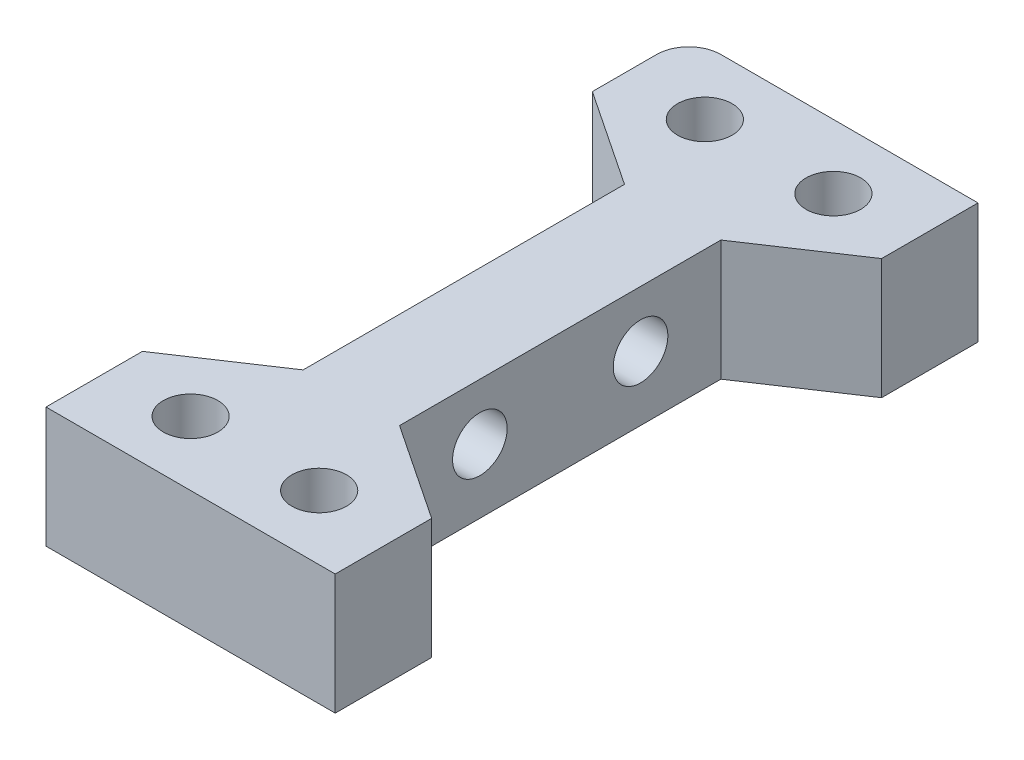
ISO-10303-21;
HEADER;
FILE_DESCRIPTION(('STEP AP214'),'2;1');
FILE_NAME('part.step','',(''),(''),'','','');
FILE_SCHEMA(('AUTOMOTIVE_DESIGN { 1 0 10303 214 1 1 1 1 }'));
ENDSEC;
DATA;
#1=APPLICATION_CONTEXT('core data for automotive mechanical design processes');
#2=APPLICATION_PROTOCOL_DEFINITION('international standard','automotive_design',2000,#1);
#3=PRODUCT_CONTEXT('',#1,'mechanical');
#4=PRODUCT('Part','Part','',(#3));
#5=PRODUCT_RELATED_PRODUCT_CATEGORY('part','',(#4));
#6=PRODUCT_DEFINITION_FORMATION('','',#4);
#7=PRODUCT_DEFINITION_CONTEXT('part definition',#1,'design');
#8=PRODUCT_DEFINITION('design','',#6,#7);
#9=PRODUCT_DEFINITION_SHAPE('','',#8);
#10=(LENGTH_UNIT() NAMED_UNIT(*) SI_UNIT(.MILLI.,.METRE.));
#11=(NAMED_UNIT(*) PLANE_ANGLE_UNIT() SI_UNIT($,.RADIAN.));
#12=(NAMED_UNIT(*) SI_UNIT($,.STERADIAN.) SOLID_ANGLE_UNIT());
#13=UNCERTAINTY_MEASURE_WITH_UNIT(LENGTH_MEASURE(1.E-05),#10,'distance_accuracy_value','');
#14=(GEOMETRIC_REPRESENTATION_CONTEXT(3) GLOBAL_UNCERTAINTY_ASSIGNED_CONTEXT((#13)) GLOBAL_UNIT_ASSIGNED_CONTEXT((#10,
#11,#12)) REPRESENTATION_CONTEXT('',''));
#15=CARTESIAN_POINT('',(0.,0.,0.));
#16=DIRECTION('',(0.,0.,1.));
#17=DIRECTION('',(1.,0.,0.));
#18=AXIS2_PLACEMENT_3D('',#15,#16,#17);
#19=CARTESIAN_POINT('',(-3.69230769230769,7.5,5.53846153846153));
#20=DIRECTION('',(-0.55470019622523,0.,0.832050294337843));
#21=DIRECTION('',(0.832050294337843,0.,0.55470019622523));
#22=AXIS2_PLACEMENT_3D('',#19,#20,#21);
#23=PLANE('',#22);
#24=DIRECTION('',(-0.832050294337843,0.,-0.55470019622523));
#25=VECTOR('',#24,1.);
#26=CARTESIAN_POINT('',(-3.69230769230769,0.,5.53846153846153));
#27=LINE('',#26,#25);
#28=CARTESIAN_POINT('',(9.,0.,14.));
#29=VERTEX_POINT('',#28);
#30=CARTESIAN_POINT('',(3.,0.,10.));
#31=VERTEX_POINT('',#30);
#32=EDGE_CURVE('E152',#29,#31,#27,.T.);
#33=ORIENTED_EDGE('',*,*,#32,.T.);
#34=DIRECTION('',(0.,-1.,0.));
#35=VECTOR('',#34,1.);
#36=CARTESIAN_POINT('',(3.,7.5,10.));
#37=LINE('',#36,#35);
#38=CARTESIAN_POINT('',(3.,7.5,10.));
#39=VERTEX_POINT('',#38);
#40=EDGE_CURVE('E132',#39,#31,#37,.T.);
#41=ORIENTED_EDGE('',*,*,#40,.F.);
#42=DIRECTION('',(-0.832050294337843,0.,-0.55470019622523));
#43=VECTOR('',#42,1.);
#44=CARTESIAN_POINT('',(-3.69230769230769,7.5,5.53846153846153));
#45=LINE('',#44,#43);
#46=CARTESIAN_POINT('',(9.,7.5,14.));
#47=VERTEX_POINT('',#46);
#48=EDGE_CURVE('E139',#47,#39,#45,.T.);
#49=ORIENTED_EDGE('',*,*,#48,.F.);
#50=DIRECTION('',(0.,-1.,0.));
#51=VECTOR('',#50,1.);
#52=CARTESIAN_POINT('',(9.,7.5,14.));
#53=LINE('',#52,#51);
#54=EDGE_CURVE('E180',#47,#29,#53,.T.);
#55=ORIENTED_EDGE('',*,*,#54,.T.);
#56=EDGE_LOOP('',(#33,#41,#49,#55));
#57=FACE_BOUND('',#56,.T.);
#58=ADVANCED_FACE('F34',(#57),#23,.F.);
#59=CARTESIAN_POINT('',(3.,7.5,0.));
#60=DIRECTION('',(-1.,0.,0.));
#61=DIRECTION('',(0.,0.,1.));
#62=AXIS2_PLACEMENT_3D('',#59,#60,#61);
#63=PLANE('',#62);
#64=CARTESIAN_POINT('',(3.,4.,5.));
#65=DIRECTION('',(1.,0.,0.));
#66=DIRECTION('',(0.,0.,-1.));
#67=AXIS2_PLACEMENT_3D('',#64,#65,#66);
#68=CIRCLE('',#67,1.7);
#69=CARTESIAN_POINT('',(3.,4.,3.3));
#70=VERTEX_POINT('',#69);
#71=EDGE_CURVE('E261',#70,#70,#68,.T.);
#72=ORIENTED_EDGE('',*,*,#71,.F.);
#73=EDGE_LOOP('',(#72));
#74=FACE_BOUND('',#73,.T.);
#75=CARTESIAN_POINT('',(3.,4.,-5.));
#76=DIRECTION('',(1.,0.,0.));
#77=DIRECTION('',(0.,0.,-1.));
#78=AXIS2_PLACEMENT_3D('',#75,#76,#77);
#79=CIRCLE('',#78,1.7);
#80=CARTESIAN_POINT('',(3.,4.,-6.7));
#81=VERTEX_POINT('',#80);
#82=EDGE_CURVE('E255',#81,#81,#79,.T.);
#83=ORIENTED_EDGE('',*,*,#82,.F.);
#84=EDGE_LOOP('',(#83));
#85=FACE_BOUND('',#84,.T.);
#86=DIRECTION('',(0.,0.,-1.));
#87=VECTOR('',#86,1.);
#88=CARTESIAN_POINT('',(3.,0.,0.));
#89=LINE('',#88,#87);
#90=CARTESIAN_POINT('',(3.,0.,-10.));
#91=VERTEX_POINT('',#90);
#92=EDGE_CURVE('E216',#31,#91,#89,.T.);
#93=ORIENTED_EDGE('',*,*,#92,.T.);
#94=DIRECTION('',(0.,-1.,0.));
#95=VECTOR('',#94,1.);
#96=CARTESIAN_POINT('',(3.,7.5,-10.));
#97=LINE('',#96,#95);
#98=CARTESIAN_POINT('',(3.,7.5,-10.));
#99=VERTEX_POINT('',#98);
#100=EDGE_CURVE('E134',#99,#91,#97,.T.);
#101=ORIENTED_EDGE('',*,*,#100,.F.);
#102=DIRECTION('',(0.,0.,-1.));
#103=VECTOR('',#102,1.);
#104=CARTESIAN_POINT('',(3.,7.5,0.));
#105=LINE('',#104,#103);
#106=EDGE_CURVE('E127',#39,#99,#105,.T.);
#107=ORIENTED_EDGE('',*,*,#106,.F.);
#108=ORIENTED_EDGE('',*,*,#40,.T.);
#109=EDGE_LOOP('',(#93,#101,#107,#108));
#110=FACE_BOUND('',#109,.T.);
#111=ADVANCED_FACE('F130',(#74,#85,#110),#63,.F.);
#112=CARTESIAN_POINT('',(-3.69230769230769,7.5,-5.53846153846154));
#113=DIRECTION('',(0.554700196225229,0.,0.832050294337844));
#114=DIRECTION('',(0.832050294337844,0.,-0.554700196225229));
#115=AXIS2_PLACEMENT_3D('',#112,#113,#114);
#116=PLANE('',#115);
#117=DIRECTION('',(-0.832050294337844,0.,0.554700196225229));
#118=VECTOR('',#117,1.);
#119=CARTESIAN_POINT('',(-3.69230769230769,0.,-5.53846153846154));
#120=LINE('',#119,#118);
#121=CARTESIAN_POINT('',(9.,0.,-14.));
#122=VERTEX_POINT('',#121);
#123=EDGE_CURVE('E213',#122,#91,#120,.T.);
#124=ORIENTED_EDGE('',*,*,#123,.F.);
#125=DIRECTION('',(0.,-1.,0.));
#126=VECTOR('',#125,1.);
#127=CARTESIAN_POINT('',(9.,7.5,-14.));
#128=LINE('',#127,#126);
#129=CARTESIAN_POINT('',(9.,7.5,-14.));
#130=VERTEX_POINT('',#129);
#131=EDGE_CURVE('E157',#130,#122,#128,.T.);
#132=ORIENTED_EDGE('',*,*,#131,.F.);
#133=DIRECTION('',(-0.832050294337844,0.,0.554700196225229));
#134=VECTOR('',#133,1.);
#135=CARTESIAN_POINT('',(-3.69230769230769,7.5,-5.53846153846154));
#136=LINE('',#135,#134);
#137=EDGE_CURVE('E138',#130,#99,#136,.T.);
#138=ORIENTED_EDGE('',*,*,#137,.T.);
#139=ORIENTED_EDGE('',*,*,#100,.T.);
#140=EDGE_LOOP('',(#124,#132,#138,#139));
#141=FACE_BOUND('',#140,.T.);
#142=ADVANCED_FACE('F279',(#141),#116,.T.);
#143=CARTESIAN_POINT('',(8.99999999999999,7.5,0.));
#144=DIRECTION('',(1.,0.,0.));
#145=DIRECTION('',(0.,0.,-1.));
#146=AXIS2_PLACEMENT_3D('',#143,#144,#145);
#147=PLANE('',#146);
#148=DIRECTION('',(0.,0.,1.));
#149=VECTOR('',#148,1.);
#150=CARTESIAN_POINT('',(8.99999999999999,0.,0.));
#151=LINE('',#150,#149);
#152=CARTESIAN_POINT('',(9.,0.,-20.));
#153=VERTEX_POINT('',#152);
#154=EDGE_CURVE('E210',#153,#122,#151,.T.);
#155=ORIENTED_EDGE('',*,*,#154,.F.);
#156=DIRECTION('',(0.,-1.,0.));
#157=VECTOR('',#156,1.);
#158=CARTESIAN_POINT('',(9.,7.5,-20.));
#159=LINE('',#158,#157);
#160=CARTESIAN_POINT('',(9.,7.5,-20.));
#161=VERTEX_POINT('',#160);
#162=EDGE_CURVE('E162',#161,#153,#159,.T.);
#163=ORIENTED_EDGE('',*,*,#162,.F.);
#164=DIRECTION('',(0.,0.,1.));
#165=VECTOR('',#164,1.);
#166=CARTESIAN_POINT('',(8.99999999999999,7.5,0.));
#167=LINE('',#166,#165);
#168=EDGE_CURVE('E249',#161,#130,#167,.T.);
#169=ORIENTED_EDGE('',*,*,#168,.T.);
#170=ORIENTED_EDGE('',*,*,#131,.T.);
#171=EDGE_LOOP('',(#155,#163,#169,#170));
#172=FACE_BOUND('',#171,.T.);
#173=ADVANCED_FACE('F360',(#172),#147,.T.);
#174=CARTESIAN_POINT('',(0.,7.5,-20.));
#175=DIRECTION('',(0.,0.,-1.));
#176=DIRECTION('',(-1.,0.,0.));
#177=AXIS2_PLACEMENT_3D('',#174,#175,#176);
#178=PLANE('',#177);
#179=DIRECTION('',(1.,0.,0.));
#180=VECTOR('',#179,1.);
#181=CARTESIAN_POINT('',(0.,0.,-20.));
#182=LINE('',#181,#180);
#183=CARTESIAN_POINT('',(-7.,0.,-20.));
#184=VERTEX_POINT('',#183);
#185=EDGE_CURVE('E208',#184,#153,#182,.T.);
#186=ORIENTED_EDGE('',*,*,#185,.F.);
#187=DIRECTION('',(0.,-1.,0.));
#188=VECTOR('',#187,1.);
#189=CARTESIAN_POINT('',(-7.,7.5,-20.));
#190=LINE('',#189,#188);
#191=CARTESIAN_POINT('',(-7.,7.5,-20.));
#192=VERTEX_POINT('',#191);
#193=EDGE_CURVE('E42',#184,#192,#190,.F.);
#194=ORIENTED_EDGE('',*,*,#193,.T.);
#195=DIRECTION('',(1.,0.,0.));
#196=VECTOR('',#195,1.);
#197=CARTESIAN_POINT('',(0.,7.5,-20.));
#198=LINE('',#197,#196);
#199=EDGE_CURVE('E247',#192,#161,#198,.T.);
#200=ORIENTED_EDGE('',*,*,#199,.T.);
#201=ORIENTED_EDGE('',*,*,#162,.T.);
#202=EDGE_LOOP('',(#186,#194,#200,#201));
#203=FACE_BOUND('',#202,.T.);
#204=ADVANCED_FACE('F356',(#203),#178,.T.);
#205=CARTESIAN_POINT('',(-9.00000000000001,7.5,0.));
#206=DIRECTION('',(-1.,0.,0.));
#207=DIRECTION('',(0.,0.,1.));
#208=AXIS2_PLACEMENT_3D('',#205,#206,#207);
#209=PLANE('',#208);
#210=DIRECTION('',(0.,0.,-1.));
#211=VECTOR('',#210,1.);
#212=CARTESIAN_POINT('',(-9.00000000000001,7.5,0.));
#213=LINE('',#212,#211);
#214=CARTESIAN_POINT('',(-9.,7.5,-14.));
#215=VERTEX_POINT('',#214);
#216=CARTESIAN_POINT('',(-9.,7.5,-18.));
#217=VERTEX_POINT('',#216);
#218=EDGE_CURVE('E244',#215,#217,#213,.T.);
#219=ORIENTED_EDGE('',*,*,#218,.T.);
#220=DIRECTION('',(0.,-1.,0.));
#221=VECTOR('',#220,1.);
#222=CARTESIAN_POINT('',(-9.,7.5,-18.));
#223=LINE('',#222,#221);
#224=CARTESIAN_POINT('',(-9.,0.,-18.));
#225=VERTEX_POINT('',#224);
#226=EDGE_CURVE('E153',#217,#225,#223,.T.);
#227=ORIENTED_EDGE('',*,*,#226,.T.);
#228=DIRECTION('',(0.,0.,-1.));
#229=VECTOR('',#228,1.);
#230=CARTESIAN_POINT('',(-9.00000000000001,0.,0.));
#231=LINE('',#230,#229);
#232=CARTESIAN_POINT('',(-9.,0.,-14.));
#233=VERTEX_POINT('',#232);
#234=EDGE_CURVE('E206',#233,#225,#231,.T.);
#235=ORIENTED_EDGE('',*,*,#234,.F.);
#236=DIRECTION('',(0.,-1.,0.));
#237=VECTOR('',#236,1.);
#238=CARTESIAN_POINT('',(-9.,7.5,-14.));
#239=LINE('',#238,#237);
#240=EDGE_CURVE('E165',#215,#233,#239,.T.);
#241=ORIENTED_EDGE('',*,*,#240,.F.);
#242=EDGE_LOOP('',(#219,#227,#235,#241));
#243=FACE_BOUND('',#242,.T.);
#244=ADVANCED_FACE('F352',(#243),#209,.T.);
#245=CARTESIAN_POINT('',(3.69230769230769,7.5,-5.53846153846154));
#246=DIRECTION('',(-0.554700196225229,0.,0.832050294337844));
#247=DIRECTION('',(0.832050294337844,0.,0.554700196225229));
#248=AXIS2_PLACEMENT_3D('',#245,#246,#247);
#249=PLANE('',#248);
#250=DIRECTION('',(-0.832050294337844,0.,-0.554700196225229));
#251=VECTOR('',#250,1.);
#252=CARTESIAN_POINT('',(3.69230769230769,0.,-5.53846153846154));
#253=LINE('',#252,#251);
#254=CARTESIAN_POINT('',(-3.,0.,-9.99999999999999));
#255=VERTEX_POINT('',#254);
#256=EDGE_CURVE('E203',#255,#233,#253,.T.);
#257=ORIENTED_EDGE('',*,*,#256,.F.);
#258=DIRECTION('',(0.,-1.,0.));
#259=VECTOR('',#258,1.);
#260=CARTESIAN_POINT('',(-3.,7.5,-9.99999999999999));
#261=LINE('',#260,#259);
#262=CARTESIAN_POINT('',(-3.,7.5,-9.99999999999999));
#263=VERTEX_POINT('',#262);
#264=EDGE_CURVE('E167',#263,#255,#261,.T.);
#265=ORIENTED_EDGE('',*,*,#264,.F.);
#266=DIRECTION('',(-0.832050294337844,0.,-0.554700196225229));
#267=VECTOR('',#266,1.);
#268=CARTESIAN_POINT('',(3.69230769230769,7.5,-5.53846153846154));
#269=LINE('',#268,#267);
#270=EDGE_CURVE('E241',#263,#215,#269,.T.);
#271=ORIENTED_EDGE('',*,*,#270,.T.);
#272=ORIENTED_EDGE('',*,*,#240,.T.);
#273=EDGE_LOOP('',(#257,#265,#271,#272));
#274=FACE_BOUND('',#273,.T.);
#275=ADVANCED_FACE('F349',(#274),#249,.T.);
#276=CARTESIAN_POINT('',(-3.,7.5,0.));
#277=DIRECTION('',(-1.,0.,0.));
#278=DIRECTION('',(0.,0.,1.));
#279=AXIS2_PLACEMENT_3D('',#276,#277,#278);
#280=PLANE('',#279);
#281=CARTESIAN_POINT('',(-3.,4.,5.));
#282=DIRECTION('',(1.,0.,0.));
#283=DIRECTION('',(0.,0.,-1.));
#284=AXIS2_PLACEMENT_3D('',#281,#282,#283);
#285=CIRCLE('',#284,1.7);
#286=CARTESIAN_POINT('',(-3.,4.,3.3));
#287=VERTEX_POINT('',#286);
#288=EDGE_CURVE('E222',#287,#287,#285,.T.);
#289=ORIENTED_EDGE('',*,*,#288,.T.);
#290=EDGE_LOOP('',(#289));
#291=FACE_BOUND('',#290,.T.);
#292=CARTESIAN_POINT('',(-3.,4.,-5.));
#293=DIRECTION('',(1.,0.,0.));
#294=DIRECTION('',(0.,0.,-1.));
#295=AXIS2_PLACEMENT_3D('',#292,#293,#294);
#296=CIRCLE('',#295,1.7);
#297=CARTESIAN_POINT('',(-3.,4.,-6.7));
#298=VERTEX_POINT('',#297);
#299=EDGE_CURVE('E258',#298,#298,#296,.T.);
#300=ORIENTED_EDGE('',*,*,#299,.T.);
#301=EDGE_LOOP('',(#300));
#302=FACE_BOUND('',#301,.T.);
#303=DIRECTION('',(0.,0.,-1.));
#304=VECTOR('',#303,1.);
#305=CARTESIAN_POINT('',(-3.,0.,0.));
#306=LINE('',#305,#304);
#307=CARTESIAN_POINT('',(-3.,0.,10.));
#308=VERTEX_POINT('',#307);
#309=EDGE_CURVE('E200',#308,#255,#306,.T.);
#310=ORIENTED_EDGE('',*,*,#309,.F.);
#311=DIRECTION('',(0.,-1.,0.));
#312=VECTOR('',#311,1.);
#313=CARTESIAN_POINT('',(-3.,7.5,10.));
#314=LINE('',#313,#312);
#315=CARTESIAN_POINT('',(-3.,7.5,10.));
#316=VERTEX_POINT('',#315);
#317=EDGE_CURVE('E169',#316,#308,#314,.T.);
#318=ORIENTED_EDGE('',*,*,#317,.F.);
#319=DIRECTION('',(0.,0.,-1.));
#320=VECTOR('',#319,1.);
#321=CARTESIAN_POINT('',(-3.,7.5,0.));
#322=LINE('',#321,#320);
#323=EDGE_CURVE('E238',#316,#263,#322,.T.);
#324=ORIENTED_EDGE('',*,*,#323,.T.);
#325=ORIENTED_EDGE('',*,*,#264,.T.);
#326=EDGE_LOOP('',(#310,#318,#324,#325));
#327=FACE_BOUND('',#326,.T.);
#328=ADVANCED_FACE('F267',(#291,#302,#327),#280,.T.);
#329=CARTESIAN_POINT('',(3.69230769230769,7.5,5.53846153846153));
#330=DIRECTION('',(0.554700196225229,0.,0.832050294337843));
#331=DIRECTION('',(0.832050294337843,0.,-0.554700196225229));
#332=AXIS2_PLACEMENT_3D('',#329,#330,#331);
#333=PLANE('',#332);
#334=DIRECTION('',(-0.832050294337843,0.,0.554700196225229));
#335=VECTOR('',#334,1.);
#336=CARTESIAN_POINT('',(3.69230769230769,0.,5.53846153846153));
#337=LINE('',#336,#335);
#338=CARTESIAN_POINT('',(-9.,0.,14.));
#339=VERTEX_POINT('',#338);
#340=EDGE_CURVE('E198',#308,#339,#337,.T.);
#341=ORIENTED_EDGE('',*,*,#340,.T.);
#342=DIRECTION('',(0.,-1.,0.));
#343=VECTOR('',#342,1.);
#344=CARTESIAN_POINT('',(-9.,7.5,14.));
#345=LINE('',#344,#343);
#346=CARTESIAN_POINT('',(-9.,7.5,14.));
#347=VERTEX_POINT('',#346);
#348=EDGE_CURVE('E171',#347,#339,#345,.T.);
#349=ORIENTED_EDGE('',*,*,#348,.F.);
#350=DIRECTION('',(-0.832050294337843,0.,0.554700196225229));
#351=VECTOR('',#350,1.);
#352=CARTESIAN_POINT('',(3.69230769230769,7.5,5.53846153846153));
#353=LINE('',#352,#351);
#354=EDGE_CURVE('E236',#316,#347,#353,.T.);
#355=ORIENTED_EDGE('',*,*,#354,.F.);
#356=ORIENTED_EDGE('',*,*,#317,.T.);
#357=EDGE_LOOP('',(#341,#349,#355,#356));
#358=FACE_BOUND('',#357,.T.);
#359=ADVANCED_FACE('F342',(#358),#333,.F.);
#360=CARTESIAN_POINT('',(-9.00000000000001,7.5,0.));
#361=DIRECTION('',(1.,0.,0.));
#362=DIRECTION('',(0.,0.,-1.));
#363=AXIS2_PLACEMENT_3D('',#360,#361,#362);
#364=PLANE('',#363);
#365=DIRECTION('',(0.,0.,1.));
#366=VECTOR('',#365,1.);
#367=CARTESIAN_POINT('',(-9.00000000000001,0.,0.));
#368=LINE('',#367,#366);
#369=CARTESIAN_POINT('',(-9.,0.,20.));
#370=VERTEX_POINT('',#369);
#371=EDGE_CURVE('E196',#339,#370,#368,.T.);
#372=ORIENTED_EDGE('',*,*,#371,.T.);
#373=DIRECTION('',(0.,-1.,0.));
#374=VECTOR('',#373,1.);
#375=CARTESIAN_POINT('',(-9.,7.5,20.));
#376=LINE('',#375,#374);
#377=CARTESIAN_POINT('',(-9.,7.5,20.));
#378=VERTEX_POINT('',#377);
#379=EDGE_CURVE('E174',#378,#370,#376,.T.);
#380=ORIENTED_EDGE('',*,*,#379,.F.);
#381=DIRECTION('',(0.,0.,1.));
#382=VECTOR('',#381,1.);
#383=CARTESIAN_POINT('',(-9.00000000000001,7.5,0.));
#384=LINE('',#383,#382);
#385=EDGE_CURVE('E234',#347,#378,#384,.T.);
#386=ORIENTED_EDGE('',*,*,#385,.F.);
#387=ORIENTED_EDGE('',*,*,#348,.T.);
#388=EDGE_LOOP('',(#372,#380,#386,#387));
#389=FACE_BOUND('',#388,.T.);
#390=ADVANCED_FACE('F336',(#389),#364,.F.);
#391=CARTESIAN_POINT('',(0.,7.5,20.));
#392=DIRECTION('',(0.,0.,-1.));
#393=DIRECTION('',(-1.,0.,0.));
#394=AXIS2_PLACEMENT_3D('',#391,#392,#393);
#395=PLANE('',#394);
#396=DIRECTION('',(1.,0.,0.));
#397=VECTOR('',#396,1.);
#398=CARTESIAN_POINT('',(0.,0.,20.));
#399=LINE('',#398,#397);
#400=CARTESIAN_POINT('',(9.,0.,20.));
#401=VERTEX_POINT('',#400);
#402=EDGE_CURVE('E194',#370,#401,#399,.T.);
#403=ORIENTED_EDGE('',*,*,#402,.T.);
#404=DIRECTION('',(0.,-1.,0.));
#405=VECTOR('',#404,1.);
#406=CARTESIAN_POINT('',(9.,7.5,20.));
#407=LINE('',#406,#405);
#408=CARTESIAN_POINT('',(9.,7.5,20.));
#409=VERTEX_POINT('',#408);
#410=EDGE_CURVE('E177',#409,#401,#407,.T.);
#411=ORIENTED_EDGE('',*,*,#410,.F.);
#412=DIRECTION('',(1.,0.,0.));
#413=VECTOR('',#412,1.);
#414=CARTESIAN_POINT('',(0.,7.5,20.));
#415=LINE('',#414,#413);
#416=EDGE_CURVE('E232',#378,#409,#415,.T.);
#417=ORIENTED_EDGE('',*,*,#416,.F.);
#418=ORIENTED_EDGE('',*,*,#379,.T.);
#419=EDGE_LOOP('',(#403,#411,#417,#418));
#420=FACE_BOUND('',#419,.T.);
#421=ADVANCED_FACE('F327',(#420),#395,.F.);
#422=CARTESIAN_POINT('',(4.,7.5,-16.));
#423=DIRECTION('',(0.,-1.,0.));
#424=DIRECTION('',(0.,0.,-1.));
#425=AXIS2_PLACEMENT_3D('',#422,#423,#424);
#426=CYLINDRICAL_SURFACE('',#425,1.7);
#427=CARTESIAN_POINT('',(4.,7.5,-16.));
#428=DIRECTION('',(0.,1.,0.));
#429=DIRECTION('',(0.,0.,1.));
#430=AXIS2_PLACEMENT_3D('',#427,#428,#429);
#431=CIRCLE('',#430,1.7);
#432=CARTESIAN_POINT('',(4.,7.5,-14.3));
#433=VERTEX_POINT('',#432);
#434=EDGE_CURVE('E225',#433,#433,#431,.T.);
#435=ORIENTED_EDGE('',*,*,#434,.T.);
#436=EDGE_LOOP('',(#435));
#437=FACE_BOUND('',#436,.T.);
#438=CARTESIAN_POINT('',(4.,0.,-16.));
#439=DIRECTION('',(0.,1.,0.));
#440=DIRECTION('',(0.,0.,1.));
#441=AXIS2_PLACEMENT_3D('',#438,#439,#440);
#442=CIRCLE('',#441,1.7);
#443=CARTESIAN_POINT('',(4.,0.,-14.3));
#444=VERTEX_POINT('',#443);
#445=EDGE_CURVE('E186',#444,#444,#442,.T.);
#446=ORIENTED_EDGE('',*,*,#445,.F.);
#447=EDGE_LOOP('',(#446));
#448=FACE_BOUND('',#447,.T.);
#449=ADVANCED_FACE('F325',(#437,#448),#426,.F.);
#450=CARTESIAN_POINT('',(-4.,7.5,16.));
#451=DIRECTION('',(0.,-1.,0.));
#452=DIRECTION('',(0.,0.,-1.));
#453=AXIS2_PLACEMENT_3D('',#450,#451,#452);
#454=CYLINDRICAL_SURFACE('',#453,1.7);
#455=CARTESIAN_POINT('',(-4.,7.5,16.));
#456=DIRECTION('',(0.,1.,0.));
#457=DIRECTION('',(0.,0.,1.));
#458=AXIS2_PLACEMENT_3D('',#455,#456,#457);
#459=CIRCLE('',#458,1.7);
#460=CARTESIAN_POINT('',(-4.,7.5,17.7));
#461=VERTEX_POINT('',#460);
#462=EDGE_CURVE('E228',#461,#461,#459,.F.);
#463=ORIENTED_EDGE('',*,*,#462,.F.);
#464=EDGE_LOOP('',(#463));
#465=FACE_BOUND('',#464,.T.);
#466=CARTESIAN_POINT('',(-4.,0.,16.));
#467=DIRECTION('',(0.,1.,0.));
#468=DIRECTION('',(0.,0.,1.));
#469=AXIS2_PLACEMENT_3D('',#466,#467,#468);
#470=CIRCLE('',#469,1.7);
#471=CARTESIAN_POINT('',(-4.,0.,17.7));
#472=VERTEX_POINT('',#471);
#473=EDGE_CURVE('E189',#472,#472,#470,.F.);
#474=ORIENTED_EDGE('',*,*,#473,.T.);
#475=EDGE_LOOP('',(#474));
#476=FACE_BOUND('',#475,.T.);
#477=ADVANCED_FACE('F310',(#465,#476),#454,.F.);
#478=CARTESIAN_POINT('',(8.99999999999999,7.5,0.));
#479=DIRECTION('',(-1.,0.,0.));
#480=DIRECTION('',(0.,0.,1.));
#481=AXIS2_PLACEMENT_3D('',#478,#479,#480);
#482=PLANE('',#481);
#483=DIRECTION('',(0.,0.,-1.));
#484=VECTOR('',#483,1.);
#485=CARTESIAN_POINT('',(8.99999999999999,0.,0.));
#486=LINE('',#485,#484);
#487=EDGE_CURVE('E192',#401,#29,#486,.T.);
#488=ORIENTED_EDGE('',*,*,#487,.T.);
#489=ORIENTED_EDGE('',*,*,#54,.F.);
#490=DIRECTION('',(0.,0.,-1.));
#491=VECTOR('',#490,1.);
#492=CARTESIAN_POINT('',(8.99999999999999,7.5,0.));
#493=LINE('',#492,#491);
#494=EDGE_CURVE('E145',#409,#47,#493,.T.);
#495=ORIENTED_EDGE('',*,*,#494,.F.);
#496=ORIENTED_EDGE('',*,*,#410,.T.);
#497=EDGE_LOOP('',(#488,#489,#495,#496));
#498=FACE_BOUND('',#497,.T.);
#499=ADVANCED_FACE('F302',(#498),#482,.F.);
#500=CARTESIAN_POINT('',(4.,7.5,16.));
#501=DIRECTION('',(0.,-1.,0.));
#502=DIRECTION('',(0.,0.,-1.));
#503=AXIS2_PLACEMENT_3D('',#500,#501,#502);
#504=CYLINDRICAL_SURFACE('',#503,1.7);
#505=CARTESIAN_POINT('',(4.,7.5,16.));
#506=DIRECTION('',(0.,1.,0.));
#507=DIRECTION('',(0.,0.,1.));
#508=AXIS2_PLACEMENT_3D('',#505,#506,#507);
#509=CIRCLE('',#508,1.7);
#510=CARTESIAN_POINT('',(4.,7.5,17.7));
#511=VERTEX_POINT('',#510);
#512=EDGE_CURVE('E149',#511,#511,#509,.F.);
#513=ORIENTED_EDGE('',*,*,#512,.F.);
#514=EDGE_LOOP('',(#513));
#515=FACE_BOUND('',#514,.T.);
#516=CARTESIAN_POINT('',(4.,0.,16.));
#517=DIRECTION('',(0.,1.,0.));
#518=DIRECTION('',(0.,0.,1.));
#519=AXIS2_PLACEMENT_3D('',#516,#517,#518);
#520=CIRCLE('',#519,1.7);
#521=CARTESIAN_POINT('',(4.,0.,17.7));
#522=VERTEX_POINT('',#521);
#523=EDGE_CURVE('E219',#522,#522,#520,.F.);
#524=ORIENTED_EDGE('',*,*,#523,.T.);
#525=EDGE_LOOP('',(#524));
#526=FACE_BOUND('',#525,.T.);
#527=ADVANCED_FACE('F299',(#515,#526),#504,.F.);
#528=CARTESIAN_POINT('',(-4.,7.5,-16.));
#529=DIRECTION('',(0.,-1.,0.));
#530=DIRECTION('',(0.,0.,-1.));
#531=AXIS2_PLACEMENT_3D('',#528,#529,#530);
#532=CYLINDRICAL_SURFACE('',#531,1.7);
#533=CARTESIAN_POINT('',(-4.,7.5,-16.));
#534=DIRECTION('',(0.,1.,0.));
#535=DIRECTION('',(0.,0.,1.));
#536=AXIS2_PLACEMENT_3D('',#533,#534,#535);
#537=CIRCLE('',#536,1.7);
#538=CARTESIAN_POINT('',(-4.,7.5,-14.3));
#539=VERTEX_POINT('',#538);
#540=EDGE_CURVE('E182',#539,#539,#537,.T.);
#541=ORIENTED_EDGE('',*,*,#540,.T.);
#542=EDGE_LOOP('',(#541));
#543=FACE_BOUND('',#542,.T.);
#544=CARTESIAN_POINT('',(-4.,0.,-16.));
#545=DIRECTION('',(0.,1.,0.));
#546=DIRECTION('',(0.,0.,1.));
#547=AXIS2_PLACEMENT_3D('',#544,#545,#546);
#548=CIRCLE('',#547,1.7);
#549=CARTESIAN_POINT('',(-4.,0.,-14.3));
#550=VERTEX_POINT('',#549);
#551=EDGE_CURVE('E183',#550,#550,#548,.T.);
#552=ORIENTED_EDGE('',*,*,#551,.F.);
#553=EDGE_LOOP('',(#552));
#554=FACE_BOUND('',#553,.T.);
#555=ADVANCED_FACE('F301',(#543,#554),#532,.F.);
#556=CARTESIAN_POINT('',(0.,7.5,0.));
#557=DIRECTION('',(0.,1.,0.));
#558=DIRECTION('',(0.,0.,1.));
#559=AXIS2_PLACEMENT_3D('',#556,#557,#558);
#560=PLANE('',#559);
#561=ORIENTED_EDGE('',*,*,#512,.T.);
#562=EDGE_LOOP('',(#561));
#563=FACE_BOUND('',#562,.T.);
#564=ORIENTED_EDGE('',*,*,#199,.F.);
#565=CARTESIAN_POINT('',(-7.,7.5,-18.));
#566=DIRECTION('',(0.,1.,0.));
#567=DIRECTION('',(0.,0.,1.));
#568=AXIS2_PLACEMENT_3D('',#565,#566,#567);
#569=CIRCLE('',#568,2.);
#570=EDGE_CURVE('E11',#192,#217,#569,.T.);
#571=ORIENTED_EDGE('',*,*,#570,.T.);
#572=ORIENTED_EDGE('',*,*,#218,.F.);
#573=ORIENTED_EDGE('',*,*,#270,.F.);
#574=ORIENTED_EDGE('',*,*,#323,.F.);
#575=ORIENTED_EDGE('',*,*,#354,.T.);
#576=ORIENTED_EDGE('',*,*,#385,.T.);
#577=ORIENTED_EDGE('',*,*,#416,.T.);
#578=ORIENTED_EDGE('',*,*,#494,.T.);
#579=ORIENTED_EDGE('',*,*,#48,.T.);
#580=ORIENTED_EDGE('',*,*,#106,.T.);
#581=ORIENTED_EDGE('',*,*,#137,.F.);
#582=ORIENTED_EDGE('',*,*,#168,.F.);
#583=EDGE_LOOP('',(#564,#571,#572,#573,#574,#575,#576,#577,#578,#579,#580,#581,#582));
#584=FACE_BOUND('',#583,.T.);
#585=ORIENTED_EDGE('',*,*,#462,.T.);
#586=EDGE_LOOP('',(#585));
#587=FACE_BOUND('',#586,.T.);
#588=ORIENTED_EDGE('',*,*,#434,.F.);
#589=EDGE_LOOP('',(#588));
#590=FACE_BOUND('',#589,.T.);
#591=ORIENTED_EDGE('',*,*,#540,.F.);
#592=EDGE_LOOP('',(#591));
#593=FACE_BOUND('',#592,.T.);
#594=ADVANCED_FACE('F142',(#563,#584,#587,#590,#593),#560,.T.);
#595=CARTESIAN_POINT('',(0.,0.,0.));
#596=DIRECTION('',(0.,1.,0.));
#597=DIRECTION('',(0.,0.,1.));
#598=AXIS2_PLACEMENT_3D('',#595,#596,#597);
#599=PLANE('',#598);
#600=ORIENTED_EDGE('',*,*,#523,.F.);
#601=EDGE_LOOP('',(#600));
#602=FACE_BOUND('',#601,.T.);
#603=ORIENTED_EDGE('',*,*,#234,.T.);
#604=CARTESIAN_POINT('',(-7.,0.,-18.));
#605=DIRECTION('',(0.,1.,0.));
#606=DIRECTION('',(0.,0.,1.));
#607=AXIS2_PLACEMENT_3D('',#604,#605,#606);
#608=CIRCLE('',#607,2.);
#609=EDGE_CURVE('E56',#225,#184,#608,.F.);
#610=ORIENTED_EDGE('',*,*,#609,.T.);
#611=ORIENTED_EDGE('',*,*,#185,.T.);
#612=ORIENTED_EDGE('',*,*,#154,.T.);
#613=ORIENTED_EDGE('',*,*,#123,.T.);
#614=ORIENTED_EDGE('',*,*,#92,.F.);
#615=ORIENTED_EDGE('',*,*,#32,.F.);
#616=ORIENTED_EDGE('',*,*,#487,.F.);
#617=ORIENTED_EDGE('',*,*,#402,.F.);
#618=ORIENTED_EDGE('',*,*,#371,.F.);
#619=ORIENTED_EDGE('',*,*,#340,.F.);
#620=ORIENTED_EDGE('',*,*,#309,.T.);
#621=ORIENTED_EDGE('',*,*,#256,.T.);
#622=EDGE_LOOP('',(#603,#610,#611,#612,#613,#614,#615,#616,#617,#618,#619,#620,#621));
#623=FACE_BOUND('',#622,.T.);
#624=ORIENTED_EDGE('',*,*,#473,.F.);
#625=EDGE_LOOP('',(#624));
#626=FACE_BOUND('',#625,.T.);
#627=ORIENTED_EDGE('',*,*,#445,.T.);
#628=EDGE_LOOP('',(#627));
#629=FACE_BOUND('',#628,.T.);
#630=ORIENTED_EDGE('',*,*,#551,.T.);
#631=EDGE_LOOP('',(#630));
#632=FACE_BOUND('',#631,.T.);
#633=ADVANCED_FACE('F284',(#602,#623,#626,#629,#632),#599,.F.);
#634=CARTESIAN_POINT('',(-3.,4.,-5.));
#635=DIRECTION('',(1.,0.,0.));
#636=DIRECTION('',(0.,0.,-1.));
#637=AXIS2_PLACEMENT_3D('',#634,#635,#636);
#638=CYLINDRICAL_SURFACE('',#637,1.7);
#639=ORIENTED_EDGE('',*,*,#299,.F.);
#640=EDGE_LOOP('',(#639));
#641=FACE_BOUND('',#640,.T.);
#642=ORIENTED_EDGE('',*,*,#82,.T.);
#643=EDGE_LOOP('',(#642));
#644=FACE_BOUND('',#643,.T.);
#645=ADVANCED_FACE('F273',(#641,#644),#638,.F.);
#646=CARTESIAN_POINT('',(-3.,4.,5.));
#647=DIRECTION('',(1.,0.,0.));
#648=DIRECTION('',(0.,0.,-1.));
#649=AXIS2_PLACEMENT_3D('',#646,#647,#648);
#650=CYLINDRICAL_SURFACE('',#649,1.7);
#651=ORIENTED_EDGE('',*,*,#288,.F.);
#652=EDGE_LOOP('',(#651));
#653=FACE_BOUND('',#652,.T.);
#654=ORIENTED_EDGE('',*,*,#71,.T.);
#655=EDGE_LOOP('',(#654));
#656=FACE_BOUND('',#655,.T.);
#657=ADVANCED_FACE('F270',(#653,#656),#650,.F.);
#658=CARTESIAN_POINT('',(-7.,7.5,-18.));
#659=DIRECTION('',(0.,-1.,0.));
#660=DIRECTION('',(0.,0.,-1.));
#661=AXIS2_PLACEMENT_3D('',#658,#659,#660);
#662=CYLINDRICAL_SURFACE('',#661,2.);
#663=ORIENTED_EDGE('',*,*,#570,.F.);
#664=ORIENTED_EDGE('',*,*,#193,.F.);
#665=ORIENTED_EDGE('',*,*,#609,.F.);
#666=ORIENTED_EDGE('',*,*,#226,.F.);
#667=EDGE_LOOP('',(#663,#664,#665,#666));
#668=FACE_BOUND('',#667,.T.);
#669=ADVANCED_FACE('F36',(#668),#662,.T.);
#670=CLOSED_SHELL('',(#58,#111,#142,#173,#204,#244,#275,#328,#359,#390,#421,#449,#477,#499,#527,
#555,#594,#633,#645,#657,#669));
#671=MANIFOLD_SOLID_BREP('B2',#670);
#672=ADVANCED_BREP_SHAPE_REPRESENTATION('',(#18,#671),#14);
#673=SHAPE_DEFINITION_REPRESENTATION(#9,#672);
ENDSEC;
END-ISO-10303-21;
